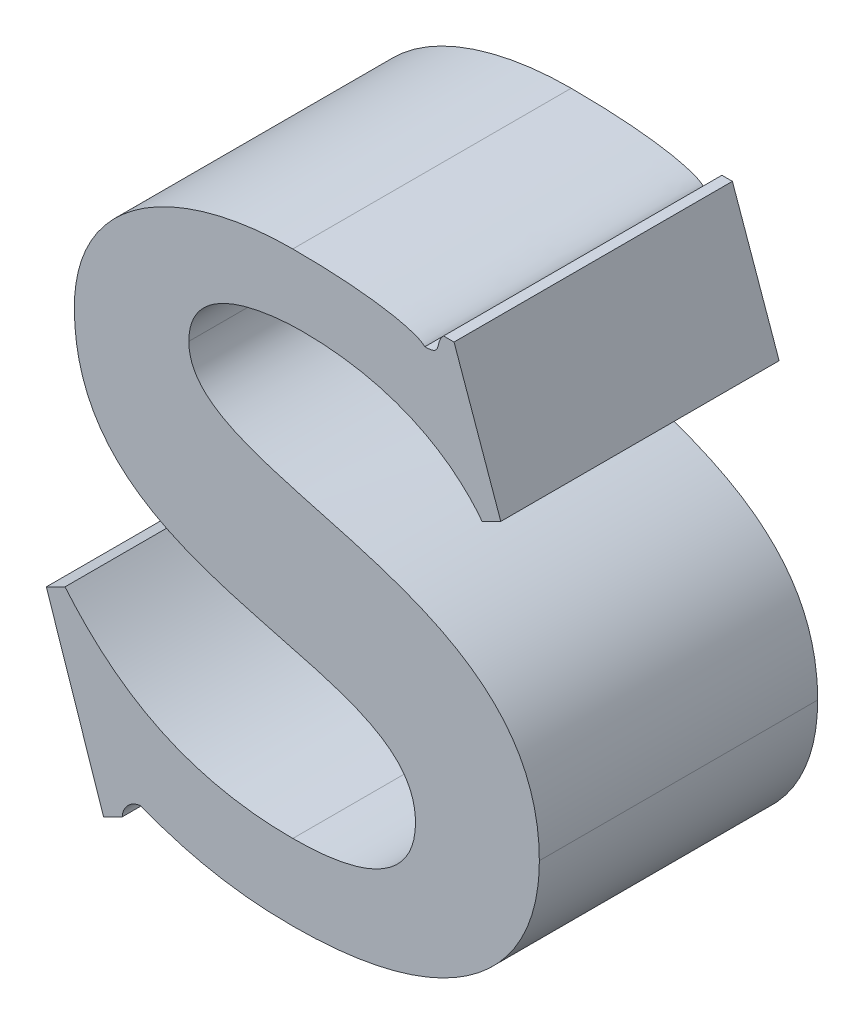
ISO-10303-21;
HEADER;
FILE_DESCRIPTION(('STEP AP214'),'2;1');
FILE_NAME('part.step','',(''),(''),'','','');
FILE_SCHEMA(('AUTOMOTIVE_DESIGN { 1 0 10303 214 1 1 1 1 }'));
ENDSEC;
DATA;
#1=APPLICATION_CONTEXT('core data for automotive mechanical design processes');
#2=APPLICATION_PROTOCOL_DEFINITION('international standard','automotive_design',2000,#1);
#3=PRODUCT_CONTEXT('',#1,'mechanical');
#4=PRODUCT('Part','Part','',(#3));
#5=PRODUCT_RELATED_PRODUCT_CATEGORY('part','',(#4));
#6=PRODUCT_DEFINITION_FORMATION('','',#4);
#7=PRODUCT_DEFINITION_CONTEXT('part definition',#1,'design');
#8=PRODUCT_DEFINITION('design','',#6,#7);
#9=PRODUCT_DEFINITION_SHAPE('','',#8);
#10=(LENGTH_UNIT() NAMED_UNIT(*) SI_UNIT(.MILLI.,.METRE.));
#11=(NAMED_UNIT(*) PLANE_ANGLE_UNIT() SI_UNIT($,.RADIAN.));
#12=(NAMED_UNIT(*) SI_UNIT($,.STERADIAN.) SOLID_ANGLE_UNIT());
#13=UNCERTAINTY_MEASURE_WITH_UNIT(LENGTH_MEASURE(1.E-05),#10,'distance_accuracy_value','');
#14=(GEOMETRIC_REPRESENTATION_CONTEXT(3) GLOBAL_UNCERTAINTY_ASSIGNED_CONTEXT((#13)) GLOBAL_UNIT_ASSIGNED_CONTEXT((#10,
#11,#12)) REPRESENTATION_CONTEXT('',''));
#15=CARTESIAN_POINT('',(0.,0.,0.));
#16=DIRECTION('',(0.,0.,1.));
#17=DIRECTION('',(1.,0.,0.));
#18=AXIS2_PLACEMENT_3D('',#15,#16,#17);
#19=CARTESIAN_POINT('',(1.577188536794,-0.08503020108,0.));
#20=DIRECTION('',(-0.447147128615345,0.894460421355273,0.));
#21=DIRECTION('',(-0.894460421355273,-0.447147128615345,0.));
#22=AXIS2_PLACEMENT_3D('',#19,#20,#21);
#23=PLANE('',#22);
#24=DIRECTION('',(0.894460421355273,0.447147128615345,0.));
#25=VECTOR('',#24,1.);
#26=CARTESIAN_POINT('',(1.57047170196,-0.088387994603,0.));
#27=LINE('',#26,#25);
#28=CARTESIAN_POINT('',(1.57047170196,-0.088387994603,0.));
#29=VERTEX_POINT('',#28);
#30=CARTESIAN_POINT('',(1.577188536794,-0.08503020108,0.));
#31=VERTEX_POINT('',#30);
#32=EDGE_CURVE('E11',#29,#31,#27,.T.);
#33=ORIENTED_EDGE('',*,*,#32,.F.);
#34=DIRECTION('',(0.,0.,1.));
#35=VECTOR('',#34,1.);
#36=CARTESIAN_POINT('',(1.57047170196,-0.088387994603,0.));
#37=LINE('',#36,#35);
#38=CARTESIAN_POINT('',(1.57047170196,-0.088387994603,0.1));
#39=VERTEX_POINT('',#38);
#40=EDGE_CURVE('E24',#29,#39,#37,.T.);
#41=ORIENTED_EDGE('',*,*,#40,.T.);
#42=DIRECTION('',(-0.894460421355273,-0.447147128615345,0.));
#43=VECTOR('',#42,1.);
#44=CARTESIAN_POINT('',(1.57047170196,-0.088387994603,0.1));
#45=LINE('',#44,#43);
#46=CARTESIAN_POINT('',(1.577188536794,-0.08503020108,0.1));
#47=VERTEX_POINT('',#46);
#48=EDGE_CURVE('E160',#47,#39,#45,.T.);
#49=ORIENTED_EDGE('',*,*,#48,.F.);
#50=DIRECTION('',(0.,0.,1.));
#51=VECTOR('',#50,1.);
#52=CARTESIAN_POINT('',(1.577188536794,-0.08503020108,0.));
#53=LINE('',#52,#51);
#54=EDGE_CURVE('E398',#31,#47,#53,.T.);
#55=ORIENTED_EDGE('',*,*,#54,.F.);
#56=EDGE_LOOP('',(#33,#41,#49,#55));
#57=FACE_BOUND('',#56,.T.);
#58=ADVANCED_FACE('F17',(#57),#23,.T.);
#59=CARTESIAN_POINT('',(1.659033038229,-0.12238503013781,0.));
#60=CARTESIAN_POINT('',(1.659033038229,-0.12238503013781,0.1));
#61=CARTESIAN_POINT('',(1.61831963578,-0.12238503013781,0.));
#62=CARTESIAN_POINT('',(1.61831963578,-0.12238503013781,0.1));
#63=CARTESIAN_POINT('',(1.594396448737,-0.10559637446581,0.));
#64=CARTESIAN_POINT('',(1.594396448737,-0.10559637446581,0.1));
#65=CARTESIAN_POINT('',(1.577188536794,-0.08503020108,0.));
#66=CARTESIAN_POINT('',(1.577188536794,-0.08503020108,0.1));
#67=B_SPLINE_SURFACE_WITH_KNOTS('',3,1,((#59,#60),(#61,#62),(#63,#64),(#65,#66)),.UNSPECIFIED.,
.F.,.F.,.F.,(4,4),(2,2),(-1.,0.),(0.,0.01),.UNSPECIFIED.);
#68=CARTESIAN_POINT('',(1.577188536794,-0.08503020108,0.));
#69=CARTESIAN_POINT('',(1.594396448737,-0.10559637446581,0.));
#70=CARTESIAN_POINT('',(1.61831963578,-0.12238503013781,0.));
#71=CARTESIAN_POINT('',(1.659033038229,-0.12238503013781,0.));
#72=B_SPLINE_CURVE_WITH_KNOTS('',3,(#68,#69,#70,#71),.UNSPECIFIED.,.F.,.F.,(4,4),(0.,1.),.UNSPECIFIED.);
#73=CARTESIAN_POINT('',(1.659033038229,-0.12238503013781,0.));
#74=VERTEX_POINT('',#73);
#75=EDGE_CURVE('E391',#31,#74,#72,.T.);
#76=CARTESIAN_POINT('',(1.659033038229,-0.12238503013781,0.1));
#77=CARTESIAN_POINT('',(1.61831963578,-0.12238503013781,0.1));
#78=CARTESIAN_POINT('',(1.594396448737,-0.10559637446581,0.1));
#79=CARTESIAN_POINT('',(1.577188536794,-0.08503020108,0.1));
#80=B_SPLINE_CURVE_WITH_KNOTS('',3,(#76,#77,#78,#79),.UNSPECIFIED.,.F.,.F.,(4,4),(-1.,0.),.UNSPECIFIED.);
#81=CARTESIAN_POINT('',(1.659033038229,-0.12238503013781,0.1));
#82=VERTEX_POINT('',#81);
#83=EDGE_CURVE('E387',#82,#47,#80,.T.);
#84=DIRECTION('',(0.,0.,1.));
#85=VECTOR('',#84,1.);
#86=CARTESIAN_POINT('',(1.659033038229,-0.12238503013781,0.));
#87=LINE('',#86,#85);
#88=EDGE_CURVE('E381',#74,#82,#87,.T.);
#89=ORIENTED_EDGE('',*,*,#75,.F.);
#90=ORIENTED_EDGE('',*,*,#54,.T.);
#91=ORIENTED_EDGE('',*,*,#83,.F.);
#92=ORIENTED_EDGE('',*,*,#88,.F.);
#93=EDGE_LOOP('',(#89,#90,#91,#92));
#94=FACE_BOUND('',#93,.T.);
#95=ADVANCED_FACE('F463',(#94),#67,.T.);
#96=CARTESIAN_POINT('',(1.703102362521,-0.095523087479,0.));
#97=CARTESIAN_POINT('',(1.703102362521,-0.095523087479,0.1));
#98=CARTESIAN_POINT('',(1.703102362521,-0.10895404321088,0.));
#99=CARTESIAN_POINT('',(1.703102362521,-0.10895404321088,0.1));
#100=CARTESIAN_POINT('',(1.69302991779,-0.12238503013781,0.));
#101=CARTESIAN_POINT('',(1.69302991779,-0.12238503013781,0.1));
#102=CARTESIAN_POINT('',(1.659033038229,-0.12238503013781,0.));
#103=CARTESIAN_POINT('',(1.659033038229,-0.12238503013781,0.1));
#104=B_SPLINE_SURFACE_WITH_KNOTS('',3,1,((#96,#97),(#98,#99),(#100,#101),(#102,#103)),
.UNSPECIFIED.,.F.,.F.,.F.,(4,4),(2,2),(-1.,0.),(0.,0.01),.UNSPECIFIED.);
#105=CARTESIAN_POINT('',(1.659033038229,-0.12238503013781,0.));
#106=CARTESIAN_POINT('',(1.69302991779,-0.12238503013781,0.));
#107=CARTESIAN_POINT('',(1.703102362521,-0.10895404321088,0.));
#108=CARTESIAN_POINT('',(1.703102362521,-0.095523087479,0.));
#109=B_SPLINE_CURVE_WITH_KNOTS('',3,(#105,#106,#107,#108),.UNSPECIFIED.,.F.,.F.,(4,4),(0.,1.),.UNSPECIFIED.);
#110=CARTESIAN_POINT('',(1.703102362521,-0.095523087479,0.));
#111=VERTEX_POINT('',#110);
#112=EDGE_CURVE('E374',#74,#111,#109,.T.);
#113=CARTESIAN_POINT('',(1.703102362521,-0.095523087479,0.1));
#114=CARTESIAN_POINT('',(1.703102362521,-0.10895404321088,0.1));
#115=CARTESIAN_POINT('',(1.69302991779,-0.12238503013781,0.1));
#116=CARTESIAN_POINT('',(1.659033038229,-0.12238503013781,0.1));
#117=B_SPLINE_CURVE_WITH_KNOTS('',3,(#113,#114,#115,#116),.UNSPECIFIED.,.F.,.F.,(4,4),(-1.,0.),.UNSPECIFIED.);
#118=CARTESIAN_POINT('',(1.703102362521,-0.095523087479,0.1));
#119=VERTEX_POINT('',#118);
#120=EDGE_CURVE('E369',#119,#82,#117,.T.);
#121=DIRECTION('',(0.,0.,1.));
#122=VECTOR('',#121,1.);
#123=CARTESIAN_POINT('',(1.703102362521,-0.095523087479,0.));
#124=LINE('',#123,#122);
#125=EDGE_CURVE('E363',#111,#119,#124,.T.);
#126=ORIENTED_EDGE('',*,*,#112,.F.);
#127=ORIENTED_EDGE('',*,*,#88,.T.);
#128=ORIENTED_EDGE('',*,*,#120,.F.);
#129=ORIENTED_EDGE('',*,*,#125,.F.);
#130=EDGE_LOOP('',(#126,#127,#128,#129));
#131=FACE_BOUND('',#130,.T.);
#132=ADVANCED_FACE('F459',(#131),#104,.T.);
#133=CARTESIAN_POINT('',(1.580545394478,0.00352991859700003,0.));
#134=CARTESIAN_POINT('',(1.580545394478,0.00352991859700003,0.1));
#135=CARTESIAN_POINT('',(1.580545394478,-0.078314832395,0.));
#136=CARTESIAN_POINT('',(1.580545394478,-0.078314832395,0.1));
#137=CARTESIAN_POINT('',(1.703102362521,-0.047675465605,0.));
#138=CARTESIAN_POINT('',(1.703102362521,-0.047675465605,0.1));
#139=CARTESIAN_POINT('',(1.703102362521,-0.095523087479,0.));
#140=CARTESIAN_POINT('',(1.703102362521,-0.095523087479,0.1));
#141=B_SPLINE_SURFACE_WITH_KNOTS('',3,1,((#133,#134),(#135,#136),(#137,#138),(#139,#140)),
.UNSPECIFIED.,.F.,.F.,.F.,(4,4),(2,2),(-1.,0.),(0.,0.01),.UNSPECIFIED.);
#142=CARTESIAN_POINT('',(1.703102362521,-0.095523087479,0.));
#143=CARTESIAN_POINT('',(1.703102362521,-0.047675465605,0.));
#144=CARTESIAN_POINT('',(1.580545394478,-0.078314832395,0.));
#145=CARTESIAN_POINT('',(1.580545394478,0.00352991859700003,0.));
#146=B_SPLINE_CURVE_WITH_KNOTS('',3,(#142,#143,#144,#145),.UNSPECIFIED.,.F.,.F.,(4,4),(0.,1.),.UNSPECIFIED.);
#147=CARTESIAN_POINT('',(1.580545394478,0.00352991859700003,0.));
#148=VERTEX_POINT('',#147);
#149=EDGE_CURVE('E356',#111,#148,#146,.T.);
#150=CARTESIAN_POINT('',(1.580545394478,0.00352991859700003,0.1));
#151=CARTESIAN_POINT('',(1.580545394478,-0.078314832395,0.1));
#152=CARTESIAN_POINT('',(1.703102362521,-0.047675465605,0.1));
#153=CARTESIAN_POINT('',(1.703102362521,-0.095523087479,0.1));
#154=B_SPLINE_CURVE_WITH_KNOTS('',3,(#150,#151,#152,#153),.UNSPECIFIED.,.F.,.F.,(4,4),(-1.,0.),.UNSPECIFIED.);
#155=CARTESIAN_POINT('',(1.580545394478,0.00352991859700003,0.1));
#156=VERTEX_POINT('',#155);
#157=EDGE_CURVE('E351',#156,#119,#154,.T.);
#158=DIRECTION('',(0.,0.,1.));
#159=VECTOR('',#158,1.);
#160=CARTESIAN_POINT('',(1.580545394478,0.00352991859700003,0.));
#161=LINE('',#160,#159);
#162=EDGE_CURVE('E345',#148,#156,#161,.T.);
#163=ORIENTED_EDGE('',*,*,#149,.F.);
#164=ORIENTED_EDGE('',*,*,#125,.T.);
#165=ORIENTED_EDGE('',*,*,#157,.F.);
#166=ORIENTED_EDGE('',*,*,#162,.F.);
#167=EDGE_LOOP('',(#163,#164,#165,#166));
#168=FACE_BOUND('',#167,.T.);
#169=ADVANCED_FACE('F455',(#168),#141,.T.);
#170=CARTESIAN_POINT('',(1.659033038229,0.061031103267,0.));
#171=CARTESIAN_POINT('',(1.659033038229,0.061031103267,0.1));
#172=CARTESIAN_POINT('',(1.61831963578,0.0610311032670001,0.));
#173=CARTESIAN_POINT('',(1.61831963578,0.0610311032670001,0.1));
#174=CARTESIAN_POINT('',(1.580545394478,0.0408846540710001,0.));
#175=CARTESIAN_POINT('',(1.580545394478,0.0408846540710001,0.1));
#176=CARTESIAN_POINT('',(1.580545394478,0.00352991859700003,0.));
#177=CARTESIAN_POINT('',(1.580545394478,0.00352991859700003,0.1));
#178=B_SPLINE_SURFACE_WITH_KNOTS('',3,1,((#170,#171),(#172,#173),(#174,#175),(#176,#177)),
.UNSPECIFIED.,.F.,.F.,.F.,(4,4),(2,2),(-1.,0.),(0.,0.01),.UNSPECIFIED.);
#179=CARTESIAN_POINT('',(1.580545394478,0.00352991859700003,0.));
#180=CARTESIAN_POINT('',(1.580545394478,0.0408846540710001,0.));
#181=CARTESIAN_POINT('',(1.61831963578,0.0610311032670001,0.));
#182=CARTESIAN_POINT('',(1.659033038229,0.061031103267,0.));
#183=B_SPLINE_CURVE_WITH_KNOTS('',3,(#179,#180,#181,#182),.UNSPECIFIED.,.F.,.F.,(4,4),(0.,1.),.UNSPECIFIED.);
#184=CARTESIAN_POINT('',(1.659033038229,0.061031103267,0.));
#185=VERTEX_POINT('',#184);
#186=EDGE_CURVE('E338',#148,#185,#183,.T.);
#187=CARTESIAN_POINT('',(1.659033038229,0.061031103267,0.1));
#188=CARTESIAN_POINT('',(1.61831963578,0.0610311032670001,0.1));
#189=CARTESIAN_POINT('',(1.580545394478,0.0408846540710001,0.1));
#190=CARTESIAN_POINT('',(1.580545394478,0.00352991859700003,0.1));
#191=B_SPLINE_CURVE_WITH_KNOTS('',3,(#187,#188,#189,#190),.UNSPECIFIED.,.F.,.F.,(4,4),(-1.,0.),.UNSPECIFIED.);
#192=CARTESIAN_POINT('',(1.659033038229,0.061031103267,0.1));
#193=VERTEX_POINT('',#192);
#194=EDGE_CURVE('E333',#193,#156,#191,.T.);
#195=DIRECTION('',(0.,0.,1.));
#196=VECTOR('',#195,1.);
#197=CARTESIAN_POINT('',(1.659033038229,0.061031103267,0.));
#198=LINE('',#197,#196);
#199=EDGE_CURVE('E327',#185,#193,#198,.T.);
#200=ORIENTED_EDGE('',*,*,#186,.F.);
#201=ORIENTED_EDGE('',*,*,#162,.T.);
#202=ORIENTED_EDGE('',*,*,#194,.F.);
#203=ORIENTED_EDGE('',*,*,#199,.F.);
#204=EDGE_LOOP('',(#200,#201,#202,#203));
#205=FACE_BOUND('',#204,.T.);
#206=ADVANCED_FACE('F451',(#205),#178,.T.);
#207=CARTESIAN_POINT('',(1.706460779938,0.054315609803,0.));
#208=CARTESIAN_POINT('',(1.706460779938,0.054315609803,0.1));
#209=CARTESIAN_POINT('',(1.703102362521,0.0576734345219999,0.));
#210=CARTESIAN_POINT('',(1.703102362521,0.0576734345219999,0.1));
#211=CARTESIAN_POINT('',(1.686314642689,0.061031103267,0.));
#212=CARTESIAN_POINT('',(1.686314642689,0.061031103267,0.1));
#213=CARTESIAN_POINT('',(1.659033038229,0.061031103267,0.));
#214=CARTESIAN_POINT('',(1.659033038229,0.061031103267,0.1));
#215=B_SPLINE_SURFACE_WITH_KNOTS('',3,1,((#207,#208),(#209,#210),(#211,#212),(#213,#214)),
.UNSPECIFIED.,.F.,.F.,.F.,(4,4),(2,2),(-1.,0.),(0.,0.01),.UNSPECIFIED.);
#216=CARTESIAN_POINT('',(1.659033038229,0.061031103267,0.));
#217=CARTESIAN_POINT('',(1.686314642689,0.061031103267,0.));
#218=CARTESIAN_POINT('',(1.703102362521,0.0576734345219999,0.));
#219=CARTESIAN_POINT('',(1.706460779938,0.054315609803,0.));
#220=B_SPLINE_CURVE_WITH_KNOTS('',3,(#216,#217,#218,#219),.UNSPECIFIED.,.F.,.F.,(4,4),(0.,1.),.UNSPECIFIED.);
#221=CARTESIAN_POINT('',(1.706460779938,0.054315609803,0.));
#222=VERTEX_POINT('',#221);
#223=EDGE_CURVE('E320',#185,#222,#220,.T.);
#224=CARTESIAN_POINT('',(1.706460779938,0.054315609803,0.1));
#225=CARTESIAN_POINT('',(1.703102362521,0.0576734345219999,0.1));
#226=CARTESIAN_POINT('',(1.686314642689,0.061031103267,0.1));
#227=CARTESIAN_POINT('',(1.659033038229,0.061031103267,0.1));
#228=B_SPLINE_CURVE_WITH_KNOTS('',3,(#224,#225,#226,#227),.UNSPECIFIED.,.F.,.F.,(4,4),(-1.,0.),.UNSPECIFIED.);
#229=CARTESIAN_POINT('',(1.706460779938,0.054315609803,0.1));
#230=VERTEX_POINT('',#229);
#231=EDGE_CURVE('E315',#230,#193,#228,.T.);
#232=DIRECTION('',(0.,0.,1.));
#233=VECTOR('',#232,1.);
#234=CARTESIAN_POINT('',(1.706460779938,0.054315609803,0.));
#235=LINE('',#234,#233);
#236=EDGE_CURVE('E309',#222,#230,#235,.T.);
#237=ORIENTED_EDGE('',*,*,#223,.F.);
#238=ORIENTED_EDGE('',*,*,#199,.T.);
#239=ORIENTED_EDGE('',*,*,#231,.F.);
#240=ORIENTED_EDGE('',*,*,#236,.F.);
#241=EDGE_LOOP('',(#237,#238,#239,#240));
#242=FACE_BOUND('',#241,.T.);
#243=ADVANCED_FACE('F447',(#242),#215,.T.);
#244=CARTESIAN_POINT('',(1.713176055039,0.061031103267,0.));
#245=CARTESIAN_POINT('',(1.713176055039,0.061031103267,0.1));
#246=CARTESIAN_POINT('',(1.709817637622,0.0576734345219997,0.));
#247=CARTESIAN_POINT('',(1.709817637622,0.0576734345219997,0.1));
#248=CARTESIAN_POINT('',(1.713176055039,0.0543156098029996,0.));
#249=CARTESIAN_POINT('',(1.713176055039,0.0543156098029996,0.1));
#250=CARTESIAN_POINT('',(1.706460779938,0.054315609803,0.));
#251=CARTESIAN_POINT('',(1.706460779938,0.054315609803,0.1));
#252=B_SPLINE_SURFACE_WITH_KNOTS('',3,1,((#244,#245),(#246,#247),(#248,#249),(#250,#251)),
.UNSPECIFIED.,.F.,.F.,.F.,(4,4),(2,2),(-1.,0.),(0.,0.01),.UNSPECIFIED.);
#253=CARTESIAN_POINT('',(1.706460779938,0.054315609803,0.));
#254=CARTESIAN_POINT('',(1.713176055039,0.0543156098029996,0.));
#255=CARTESIAN_POINT('',(1.709817637622,0.0576734345219997,0.));
#256=CARTESIAN_POINT('',(1.713176055039,0.061031103267,0.));
#257=B_SPLINE_CURVE_WITH_KNOTS('',3,(#253,#254,#255,#256),.UNSPECIFIED.,.F.,.F.,(4,4),(0.,1.),.UNSPECIFIED.);
#258=CARTESIAN_POINT('',(1.713176055039,0.061031103267,0.));
#259=VERTEX_POINT('',#258);
#260=EDGE_CURVE('E302',#222,#259,#257,.T.);
#261=CARTESIAN_POINT('',(1.713176055039,0.061031103267,0.1));
#262=CARTESIAN_POINT('',(1.709817637622,0.0576734345219997,0.1));
#263=CARTESIAN_POINT('',(1.713176055039,0.0543156098029996,0.1));
#264=CARTESIAN_POINT('',(1.706460779938,0.054315609803,0.1));
#265=B_SPLINE_CURVE_WITH_KNOTS('',3,(#261,#262,#263,#264),.UNSPECIFIED.,.F.,.F.,(4,4),(-1.,0.),.UNSPECIFIED.);
#266=CARTESIAN_POINT('',(1.713176055039,0.061031103267,0.1));
#267=VERTEX_POINT('',#266);
#268=EDGE_CURVE('E297',#267,#230,#265,.T.);
#269=DIRECTION('',(0.,0.,1.));
#270=VECTOR('',#269,1.);
#271=CARTESIAN_POINT('',(1.713176055039,0.061031103267,0.));
#272=LINE('',#271,#270);
#273=EDGE_CURVE('E294',#259,#267,#272,.T.);
#274=ORIENTED_EDGE('',*,*,#260,.F.);
#275=ORIENTED_EDGE('',*,*,#236,.T.);
#276=ORIENTED_EDGE('',*,*,#268,.F.);
#277=ORIENTED_EDGE('',*,*,#273,.F.);
#278=EDGE_LOOP('',(#274,#275,#276,#277));
#279=FACE_BOUND('',#278,.T.);
#280=ADVANCED_FACE('F443',(#279),#252,.T.);
#281=CARTESIAN_POINT('',(1.716953104833,0.061031103267,0.));
#282=DIRECTION('',(0.,1.,0.));
#283=DIRECTION('',(-1.,0.,0.));
#284=AXIS2_PLACEMENT_3D('',#281,#282,#283);
#285=PLANE('',#284);
#286=DIRECTION('',(1.,0.,0.));
#287=VECTOR('',#286,1.);
#288=CARTESIAN_POINT('',(1.713176055039,0.061031103267,0.));
#289=LINE('',#288,#287);
#290=CARTESIAN_POINT('',(1.716953104833,0.061031103267,0.));
#291=VERTEX_POINT('',#290);
#292=EDGE_CURVE('E292',#259,#291,#289,.T.);
#293=ORIENTED_EDGE('',*,*,#292,.F.);
#294=ORIENTED_EDGE('',*,*,#273,.T.);
#295=DIRECTION('',(-1.,0.,0.));
#296=VECTOR('',#295,1.);
#297=CARTESIAN_POINT('',(1.713176055039,0.061031103267,0.1));
#298=LINE('',#297,#296);
#299=CARTESIAN_POINT('',(1.716953104833,0.061031103267,0.1));
#300=VERTEX_POINT('',#299);
#301=EDGE_CURVE('E289',#300,#267,#298,.T.);
#302=ORIENTED_EDGE('',*,*,#301,.F.);
#303=DIRECTION('',(0.,0.,1.));
#304=VECTOR('',#303,1.);
#305=CARTESIAN_POINT('',(1.716953104833,0.061031103267,0.));
#306=LINE('',#305,#304);
#307=EDGE_CURVE('E286',#291,#300,#306,.T.);
#308=ORIENTED_EDGE('',*,*,#307,.F.);
#309=EDGE_LOOP('',(#293,#294,#302,#308));
#310=FACE_BOUND('',#309,.T.);
#311=ADVANCED_FACE('F439',(#310),#285,.T.);
#312=CARTESIAN_POINT('',(1.733742384398,0.013603112,0.));
#313=DIRECTION('',(0.942678091152355,0.33370348583938,0.));
#314=DIRECTION('',(-0.33370348583938,0.942678091152355,0.));
#315=AXIS2_PLACEMENT_3D('',#312,#313,#314);
#316=PLANE('',#315);
#317=DIRECTION('',(0.33370348583938,-0.942678091152355,0.));
#318=VECTOR('',#317,1.);
#319=CARTESIAN_POINT('',(1.716953104833,0.061031103267,0.));
#320=LINE('',#319,#318);
#321=CARTESIAN_POINT('',(1.733742384398,0.013603112,0.));
#322=VERTEX_POINT('',#321);
#323=EDGE_CURVE('E284',#291,#322,#320,.T.);
#324=ORIENTED_EDGE('',*,*,#323,.F.);
#325=ORIENTED_EDGE('',*,*,#307,.T.);
#326=DIRECTION('',(-0.33370348583938,0.942678091152355,0.));
#327=VECTOR('',#326,1.);
#328=CARTESIAN_POINT('',(1.716953104833,0.061031103267,0.1));
#329=LINE('',#328,#327);
#330=CARTESIAN_POINT('',(1.733742384398,0.013603112,0.1));
#331=VERTEX_POINT('',#330);
#332=EDGE_CURVE('E281',#331,#300,#329,.T.);
#333=ORIENTED_EDGE('',*,*,#332,.F.);
#334=DIRECTION('',(0.,0.,1.));
#335=VECTOR('',#334,1.);
#336=CARTESIAN_POINT('',(1.733742384398,0.013603112,0.));
#337=LINE('',#336,#335);
#338=EDGE_CURVE('E278',#322,#331,#337,.T.);
#339=ORIENTED_EDGE('',*,*,#338,.F.);
#340=EDGE_LOOP('',(#324,#325,#333,#339));
#341=FACE_BOUND('',#340,.T.);
#342=ADVANCED_FACE('F435',(#341),#316,.T.);
#343=CARTESIAN_POINT('',(1.727026797351,0.01024541206,0.));
#344=DIRECTION('',(0.447203624151053,-0.894432176604891,0.));
#345=DIRECTION('',(0.894432176604891,0.447203624151053,0.));
#346=AXIS2_PLACEMENT_3D('',#343,#344,#345);
#347=PLANE('',#346);
#348=DIRECTION('',(-0.894432176604891,-0.447203624151053,0.));
#349=VECTOR('',#348,1.);
#350=CARTESIAN_POINT('',(1.733742384398,0.013603112,0.));
#351=LINE('',#350,#349);
#352=CARTESIAN_POINT('',(1.727026797351,0.01024541206,0.));
#353=VERTEX_POINT('',#352);
#354=EDGE_CURVE('E276',#322,#353,#351,.T.);
#355=ORIENTED_EDGE('',*,*,#354,.F.);
#356=ORIENTED_EDGE('',*,*,#338,.T.);
#357=DIRECTION('',(0.894432176604891,0.447203624151053,0.));
#358=VECTOR('',#357,1.);
#359=CARTESIAN_POINT('',(1.733742384398,0.013603112,0.1));
#360=LINE('',#359,#358);
#361=CARTESIAN_POINT('',(1.727026797351,0.01024541206,0.1));
#362=VERTEX_POINT('',#361);
#363=EDGE_CURVE('E273',#362,#331,#360,.T.);
#364=ORIENTED_EDGE('',*,*,#363,.F.);
#365=DIRECTION('',(0.,0.,1.));
#366=VECTOR('',#365,1.);
#367=CARTESIAN_POINT('',(1.727026797351,0.01024541206,0.));
#368=LINE('',#367,#366);
#369=EDGE_CURVE('E267',#353,#362,#368,.T.);
#370=ORIENTED_EDGE('',*,*,#369,.F.);
#371=EDGE_LOOP('',(#355,#356,#364,#370));
#372=FACE_BOUND('',#371,.T.);
#373=ADVANCED_FACE('F431',(#372),#347,.T.);
#374=CARTESIAN_POINT('',(1.662390207859,0.037107229941,0.));
#375=CARTESIAN_POINT('',(1.662390207859,0.037107229941,0.1));
#376=CARTESIAN_POINT('',(1.677661290627,0.0371072299409998,0.));
#377=CARTESIAN_POINT('',(1.677661290627,0.0371072299409998,0.1));
#378=CARTESIAN_POINT('',(1.690242679099,0.0343974842097056,0.));
#379=CARTESIAN_POINT('',(1.690242679099,0.0343974842097056,0.1));
#380=CARTESIAN_POINT('',(1.70605954615,0.0278138539980836,0.));
#381=CARTESIAN_POINT('',(1.70605954615,0.0278138539980836,0.1));
#382=CARTESIAN_POINT('',(1.711428924585,0.0247907650219827,0.));
#383=CARTESIAN_POINT('',(1.711428924585,0.0247907650219827,0.1));
#384=CARTESIAN_POINT('',(1.720311878263,0.0179268910252067,0.));
#385=CARTESIAN_POINT('',(1.720311878263,0.0179268910252067,0.1));
#386=CARTESIAN_POINT('',(1.723980087419,0.0143075095671831,0.));
#387=CARTESIAN_POINT('',(1.723980087419,0.0143075095671831,0.1));
#388=CARTESIAN_POINT('',(1.727026797351,0.01024541206,0.));
#389=CARTESIAN_POINT('',(1.727026797351,0.01024541206,0.1));
#390=B_SPLINE_SURFACE_WITH_KNOTS('',3,1,((#374,#375),(#376,#377),(#378,#379),(#380,#381),(#382,
#383),(#384,#385),(#386,#387),(#388,#389)),.UNSPECIFIED.,.F.,.F.,.F.,(4,2,2,4),(2,2),
(-0.006623543838758,-0.003350800198409,-0.001523311189817,0.),(0.,0.01),.UNSPECIFIED.);
#391=CARTESIAN_POINT('',(1.727026797351,0.01024541206,0.));
#392=CARTESIAN_POINT('',(1.723980087419,0.0143075095671831,0.));
#393=CARTESIAN_POINT('',(1.720311878263,0.0179268910252067,0.));
#394=CARTESIAN_POINT('',(1.711428924585,0.0247907650219827,0.));
#395=CARTESIAN_POINT('',(1.70605954615,0.0278138539980836,0.));
#396=CARTESIAN_POINT('',(1.690242679099,0.0343974842097056,0.));
#397=CARTESIAN_POINT('',(1.677661290627,0.0371072299409998,0.));
#398=CARTESIAN_POINT('',(1.662390207859,0.037107229941,0.));
#399=B_SPLINE_CURVE_WITH_KNOTS('',3,(#391,#392,#393,#394,#395,#396,#397,#398),.UNSPECIFIED.,.F.,
.F.,(4,2,2,4),(0.,0.001523311189817,0.003350800198409,0.006623543838758),.UNSPECIFIED.);
#400=CARTESIAN_POINT('',(1.662390207859,0.037107229941,0.));
#401=VERTEX_POINT('',#400);
#402=EDGE_CURVE('E260',#353,#401,#399,.T.);
#403=CARTESIAN_POINT('',(1.662390207859,0.037107229941,0.1));
#404=CARTESIAN_POINT('',(1.677661290627,0.0371072299409998,0.1));
#405=CARTESIAN_POINT('',(1.690242679099,0.0343974842097056,0.1));
#406=CARTESIAN_POINT('',(1.70605954615,0.0278138539980836,0.1));
#407=CARTESIAN_POINT('',(1.711428924585,0.0247907650219827,0.1));
#408=CARTESIAN_POINT('',(1.720311878263,0.0179268910252067,0.1));
#409=CARTESIAN_POINT('',(1.723980087419,0.0143075095671831,0.1));
#410=CARTESIAN_POINT('',(1.727026797351,0.01024541206,0.1));
#411=B_SPLINE_CURVE_WITH_KNOTS('',3,(#403,#404,#405,#406,#407,#408,#409,#410),.UNSPECIFIED.,.F.,
.F.,(4,2,2,4),(-0.006623543838758,-0.003350800198409,-0.001523311189817,0.),.UNSPECIFIED.);
#412=CARTESIAN_POINT('',(1.662390207859,0.037107229941,0.1));
#413=VERTEX_POINT('',#412);
#414=EDGE_CURVE('E255',#413,#362,#411,.T.);
#415=DIRECTION('',(0.,0.,1.));
#416=VECTOR('',#415,1.);
#417=CARTESIAN_POINT('',(1.662390207859,0.037107229941,0.));
#418=LINE('',#417,#416);
#419=EDGE_CURVE('E249',#401,#413,#418,.T.);
#420=ORIENTED_EDGE('',*,*,#402,.F.);
#421=ORIENTED_EDGE('',*,*,#369,.T.);
#422=ORIENTED_EDGE('',*,*,#414,.F.);
#423=ORIENTED_EDGE('',*,*,#419,.F.);
#424=EDGE_LOOP('',(#420,#421,#422,#423));
#425=FACE_BOUND('',#424,.T.);
#426=ADVANCED_FACE('F427',(#425),#390,.T.);
#427=CARTESIAN_POINT('',(1.62167774125,0.013603112,0.));
#428=CARTESIAN_POINT('',(1.62167774125,0.013603112,0.1));
#429=CARTESIAN_POINT('',(1.62167774125,0.0337495611960002,0.));
#430=CARTESIAN_POINT('',(1.62167774125,0.0337495611960002,0.1));
#431=CARTESIAN_POINT('',(1.648959345711,0.0371072299410002,0.));
#432=CARTESIAN_POINT('',(1.648959345711,0.0371072299410002,0.1));
#433=CARTESIAN_POINT('',(1.662390207859,0.037107229941,0.));
#434=CARTESIAN_POINT('',(1.662390207859,0.037107229941,0.1));
#435=B_SPLINE_SURFACE_WITH_KNOTS('',3,1,((#427,#428),(#429,#430),(#431,#432),(#433,#434)),
.UNSPECIFIED.,.F.,.F.,.F.,(4,4),(2,2),(-1.,0.),(0.,0.01),.UNSPECIFIED.);
#436=CARTESIAN_POINT('',(1.662390207859,0.037107229941,0.));
#437=CARTESIAN_POINT('',(1.648959345711,0.0371072299410002,0.));
#438=CARTESIAN_POINT('',(1.62167774125,0.0337495611960002,0.));
#439=CARTESIAN_POINT('',(1.62167774125,0.013603112,0.));
#440=B_SPLINE_CURVE_WITH_KNOTS('',3,(#436,#437,#438,#439),.UNSPECIFIED.,.F.,.F.,(4,4),(0.,1.),.UNSPECIFIED.);
#441=CARTESIAN_POINT('',(1.62167774125,0.013603112,0.));
#442=VERTEX_POINT('',#441);
#443=EDGE_CURVE('E242',#401,#442,#440,.T.);
#444=CARTESIAN_POINT('',(1.62167774125,0.013603112,0.1));
#445=CARTESIAN_POINT('',(1.62167774125,0.0337495611960002,0.1));
#446=CARTESIAN_POINT('',(1.648959345711,0.0371072299410002,0.1));
#447=CARTESIAN_POINT('',(1.662390207859,0.037107229941,0.1));
#448=B_SPLINE_CURVE_WITH_KNOTS('',3,(#444,#445,#446,#447),.UNSPECIFIED.,.F.,.F.,(4,4),(-1.,0.),.UNSPECIFIED.);
#449=CARTESIAN_POINT('',(1.62167774125,0.013603112,0.1));
#450=VERTEX_POINT('',#449);
#451=EDGE_CURVE('E237',#450,#413,#448,.T.);
#452=DIRECTION('',(0.,0.,1.));
#453=VECTOR('',#452,1.);
#454=CARTESIAN_POINT('',(1.62167774125,0.013603112,0.));
#455=LINE('',#454,#453);
#456=EDGE_CURVE('E231',#442,#450,#455,.T.);
#457=ORIENTED_EDGE('',*,*,#443,.F.);
#458=ORIENTED_EDGE('',*,*,#419,.T.);
#459=ORIENTED_EDGE('',*,*,#451,.F.);
#460=ORIENTED_EDGE('',*,*,#456,.F.);
#461=EDGE_LOOP('',(#457,#458,#459,#460));
#462=FACE_BOUND('',#461,.T.);
#463=ADVANCED_FACE('F423',(#462),#435,.T.);
#464=CARTESIAN_POINT('',(1.74759312671,-0.08503020108,0.));
#465=CARTESIAN_POINT('',(1.74759312671,-0.08503020108,0.1));
#466=CARTESIAN_POINT('',(1.74759312671,-0.00360526786199997,0.));
#467=CARTESIAN_POINT('',(1.74759312671,-0.00360526786199997,0.1));
#468=CARTESIAN_POINT('',(1.62167774125,-0.027109416998,0.));
#469=CARTESIAN_POINT('',(1.62167774125,-0.027109416998,0.1));
#470=CARTESIAN_POINT('',(1.62167774125,0.013603112,0.));
#471=CARTESIAN_POINT('',(1.62167774125,0.013603112,0.1));
#472=B_SPLINE_SURFACE_WITH_KNOTS('',3,1,((#464,#465),(#466,#467),(#468,#469),(#470,#471)),
.UNSPECIFIED.,.F.,.F.,.F.,(4,4),(2,2),(-1.,0.),(0.,0.01),.UNSPECIFIED.);
#473=CARTESIAN_POINT('',(1.62167774125,0.013603112,0.));
#474=CARTESIAN_POINT('',(1.62167774125,-0.027109416998,0.));
#475=CARTESIAN_POINT('',(1.74759312671,-0.00360526786199997,0.));
#476=CARTESIAN_POINT('',(1.74759312671,-0.08503020108,0.));
#477=B_SPLINE_CURVE_WITH_KNOTS('',3,(#473,#474,#475,#476),.UNSPECIFIED.,.F.,.F.,(4,4),(0.,1.),.UNSPECIFIED.);
#478=CARTESIAN_POINT('',(1.74759312671,-0.08503020108,0.));
#479=VERTEX_POINT('',#478);
#480=EDGE_CURVE('E224',#442,#479,#477,.T.);
#481=CARTESIAN_POINT('',(1.74759312671,-0.08503020108,0.1));
#482=CARTESIAN_POINT('',(1.74759312671,-0.00360526786199997,0.1));
#483=CARTESIAN_POINT('',(1.62167774125,-0.027109416998,0.1));
#484=CARTESIAN_POINT('',(1.62167774125,0.013603112,0.1));
#485=B_SPLINE_CURVE_WITH_KNOTS('',3,(#481,#482,#483,#484),.UNSPECIFIED.,.F.,.F.,(4,4),(-1.,0.),.UNSPECIFIED.);
#486=CARTESIAN_POINT('',(1.74759312671,-0.08503020108,0.1));
#487=VERTEX_POINT('',#486);
#488=EDGE_CURVE('E219',#487,#450,#485,.T.);
#489=DIRECTION('',(0.,0.,1.));
#490=VECTOR('',#489,1.);
#491=CARTESIAN_POINT('',(1.74759312671,-0.08503020108,0.));
#492=LINE('',#491,#490);
#493=EDGE_CURVE('E213',#479,#487,#492,.T.);
#494=ORIENTED_EDGE('',*,*,#480,.F.);
#495=ORIENTED_EDGE('',*,*,#456,.T.);
#496=ORIENTED_EDGE('',*,*,#488,.F.);
#497=ORIENTED_EDGE('',*,*,#493,.F.);
#498=EDGE_LOOP('',(#494,#495,#496,#497));
#499=FACE_BOUND('',#498,.T.);
#500=ADVANCED_FACE('F419',(#499),#472,.T.);
#501=CARTESIAN_POINT('',(1.659033038229,-0.14966657220882,0.));
#502=CARTESIAN_POINT('',(1.659033038229,-0.14966657220882,0.1));
#503=CARTESIAN_POINT('',(1.716953104833,-0.14966657220882,0.));
#504=CARTESIAN_POINT('',(1.716953104833,-0.14966657220882,0.1));
#505=CARTESIAN_POINT('',(1.74759312671,-0.12238503013781,0.));
#506=CARTESIAN_POINT('',(1.74759312671,-0.12238503013781,0.1));
#507=CARTESIAN_POINT('',(1.74759312671,-0.08503020108,0.));
#508=CARTESIAN_POINT('',(1.74759312671,-0.08503020108,0.1));
#509=B_SPLINE_SURFACE_WITH_KNOTS('',3,1,((#501,#502),(#503,#504),(#505,#506),(#507,#508)),
.UNSPECIFIED.,.F.,.F.,.F.,(4,4),(2,2),(-1.,0.),(0.,0.01),.UNSPECIFIED.);
#510=CARTESIAN_POINT('',(1.74759312671,-0.08503020108,0.));
#511=CARTESIAN_POINT('',(1.74759312671,-0.12238503013781,0.));
#512=CARTESIAN_POINT('',(1.716953104833,-0.14966657220882,0.));
#513=CARTESIAN_POINT('',(1.659033038229,-0.14966657220882,0.));
#514=B_SPLINE_CURVE_WITH_KNOTS('',3,(#510,#511,#512,#513),.UNSPECIFIED.,.F.,.F.,(4,4),(0.,1.),.UNSPECIFIED.);
#515=CARTESIAN_POINT('',(1.659033038229,-0.14966657220882,0.));
#516=VERTEX_POINT('',#515);
#517=EDGE_CURVE('E206',#479,#516,#514,.T.);
#518=CARTESIAN_POINT('',(1.659033038229,-0.14966657220882,0.1));
#519=CARTESIAN_POINT('',(1.716953104833,-0.14966657220882,0.1));
#520=CARTESIAN_POINT('',(1.74759312671,-0.12238503013781,0.1));
#521=CARTESIAN_POINT('',(1.74759312671,-0.08503020108,0.1));
#522=B_SPLINE_CURVE_WITH_KNOTS('',3,(#518,#519,#520,#521),.UNSPECIFIED.,.F.,.F.,(4,4),(-1.,0.),.UNSPECIFIED.);
#523=CARTESIAN_POINT('',(1.659033038229,-0.14966657220882,0.1));
#524=VERTEX_POINT('',#523);
#525=EDGE_CURVE('E201',#524,#487,#522,.T.);
#526=DIRECTION('',(0.,0.,1.));
#527=VECTOR('',#526,1.);
#528=CARTESIAN_POINT('',(1.659033038229,-0.14966657220882,0.));
#529=LINE('',#528,#527);
#530=EDGE_CURVE('E195',#516,#524,#529,.T.);
#531=ORIENTED_EDGE('',*,*,#517,.F.);
#532=ORIENTED_EDGE('',*,*,#493,.T.);
#533=ORIENTED_EDGE('',*,*,#525,.F.);
#534=ORIENTED_EDGE('',*,*,#530,.F.);
#535=EDGE_LOOP('',(#531,#532,#533,#534));
#536=FACE_BOUND('',#535,.T.);
#537=ADVANCED_FACE('F415',(#536),#509,.T.);
#538=CARTESIAN_POINT('',(1.604469829308,-0.13959341000028,0.));
#539=CARTESIAN_POINT('',(1.604469829308,-0.13959341000028,0.1));
#540=CARTESIAN_POINT('',(1.62167774125,-0.14630890346375,0.));
#541=CARTESIAN_POINT('',(1.62167774125,-0.14630890346375,0.1));
#542=CARTESIAN_POINT('',(1.638467020816,-0.14966657220882,0.));
#543=CARTESIAN_POINT('',(1.638467020816,-0.14966657220882,0.1));
#544=CARTESIAN_POINT('',(1.659033038229,-0.14966657220882,0.));
#545=CARTESIAN_POINT('',(1.659033038229,-0.14966657220882,0.1));
#546=B_SPLINE_SURFACE_WITH_KNOTS('',3,1,((#538,#539),(#540,#541),(#542,#543),(#544,#545)),
.UNSPECIFIED.,.F.,.F.,.F.,(4,4),(2,2),(-1.,0.),(0.,0.01),.UNSPECIFIED.);
#547=CARTESIAN_POINT('',(1.659033038229,-0.14966657220882,0.));
#548=CARTESIAN_POINT('',(1.638467020816,-0.14966657220882,0.));
#549=CARTESIAN_POINT('',(1.62167774125,-0.14630890346375,0.));
#550=CARTESIAN_POINT('',(1.604469829308,-0.13959341000028,0.));
#551=B_SPLINE_CURVE_WITH_KNOTS('',3,(#547,#548,#549,#550),.UNSPECIFIED.,.F.,.F.,(4,4),(0.,1.),.UNSPECIFIED.);
#552=CARTESIAN_POINT('',(1.604469829308,-0.13959341000028,0.));
#553=VERTEX_POINT('',#552);
#554=EDGE_CURVE('E188',#516,#553,#551,.T.);
#555=CARTESIAN_POINT('',(1.604469829308,-0.13959341000028,0.1));
#556=CARTESIAN_POINT('',(1.62167774125,-0.14630890346375,0.1));
#557=CARTESIAN_POINT('',(1.638467020816,-0.14966657220882,0.1));
#558=CARTESIAN_POINT('',(1.659033038229,-0.14966657220882,0.1));
#559=B_SPLINE_CURVE_WITH_KNOTS('',3,(#555,#556,#557,#558),.UNSPECIFIED.,.F.,.F.,(4,4),(-1.,0.),.UNSPECIFIED.);
#560=CARTESIAN_POINT('',(1.604469829308,-0.13959341000028,0.1));
#561=VERTEX_POINT('',#560);
#562=EDGE_CURVE('E183',#561,#524,#559,.T.);
#563=DIRECTION('',(0.,0.,1.));
#564=VECTOR('',#563,1.);
#565=CARTESIAN_POINT('',(1.604469829308,-0.13959341000028,0.));
#566=LINE('',#565,#564);
#567=EDGE_CURVE('E177',#553,#561,#566,.T.);
#568=ORIENTED_EDGE('',*,*,#554,.F.);
#569=ORIENTED_EDGE('',*,*,#530,.T.);
#570=ORIENTED_EDGE('',*,*,#562,.F.);
#571=ORIENTED_EDGE('',*,*,#567,.F.);
#572=EDGE_LOOP('',(#568,#569,#570,#571));
#573=FACE_BOUND('',#572,.T.);
#574=ADVANCED_FACE('F411',(#573),#546,.T.);
#575=CARTESIAN_POINT('',(1.597754554207,-0.14630890346375,0.));
#576=CARTESIAN_POINT('',(1.597754554207,-0.14630890346375,0.1));
#577=CARTESIAN_POINT('',(1.597754554207,-0.14295107874535,0.));
#578=CARTESIAN_POINT('',(1.597754554207,-0.14295107874535,0.1));
#579=CARTESIAN_POINT('',(1.601111723837,-0.13959341000028,0.));
#580=CARTESIAN_POINT('',(1.601111723837,-0.13959341000028,0.1));
#581=CARTESIAN_POINT('',(1.604469829308,-0.13959341000028,0.));
#582=CARTESIAN_POINT('',(1.604469829308,-0.13959341000028,0.1));
#583=B_SPLINE_SURFACE_WITH_KNOTS('',3,1,((#575,#576),(#577,#578),(#579,#580),(#581,#582)),
.UNSPECIFIED.,.F.,.F.,.F.,(4,4),(2,2),(-1.,0.),(0.,0.01),.UNSPECIFIED.);
#584=CARTESIAN_POINT('',(1.604469829308,-0.13959341000028,0.));
#585=CARTESIAN_POINT('',(1.601111723837,-0.13959341000028,0.));
#586=CARTESIAN_POINT('',(1.597754554207,-0.14295107874535,0.));
#587=CARTESIAN_POINT('',(1.597754554207,-0.14630890346375,0.));
#588=B_SPLINE_CURVE_WITH_KNOTS('',3,(#584,#585,#586,#587),.UNSPECIFIED.,.F.,.F.,(4,4),(0.,1.),.UNSPECIFIED.);
#589=CARTESIAN_POINT('',(1.597754554207,-0.14630890346375,0.));
#590=VERTEX_POINT('',#589);
#591=EDGE_CURVE('E170',#553,#590,#588,.T.);
#592=CARTESIAN_POINT('',(1.597754554207,-0.14630890346375,0.1));
#593=CARTESIAN_POINT('',(1.597754554207,-0.14295107874535,0.1));
#594=CARTESIAN_POINT('',(1.601111723837,-0.13959341000028,0.1));
#595=CARTESIAN_POINT('',(1.604469829308,-0.13959341000028,0.1));
#596=B_SPLINE_CURVE_WITH_KNOTS('',3,(#592,#593,#594,#595),.UNSPECIFIED.,.F.,.F.,(4,4),(-1.,0.),.UNSPECIFIED.);
#597=CARTESIAN_POINT('',(1.597754554207,-0.14630890346375,0.1));
#598=VERTEX_POINT('',#597);
#599=EDGE_CURVE('E166',#598,#561,#596,.T.);
#600=DIRECTION('',(0.,0.,1.));
#601=VECTOR('',#600,1.);
#602=CARTESIAN_POINT('',(1.597754554207,-0.14630890346375,0.));
#603=LINE('',#602,#601);
#604=EDGE_CURVE('E145',#590,#598,#603,.T.);
#605=ORIENTED_EDGE('',*,*,#591,.F.);
#606=ORIENTED_EDGE('',*,*,#567,.T.);
#607=ORIENTED_EDGE('',*,*,#599,.F.);
#608=ORIENTED_EDGE('',*,*,#604,.F.);
#609=EDGE_LOOP('',(#605,#606,#607,#608));
#610=FACE_BOUND('',#609,.T.);
#611=ADVANCED_FACE('F409',(#610),#583,.T.);
#612=CARTESIAN_POINT('',(1.59103803132,-0.14966657220882,0.));
#613=DIRECTION('',(0.447150449295377,-0.894458761315994,0.));
#614=DIRECTION('',(0.894458761315994,0.447150449295377,0.));
#615=AXIS2_PLACEMENT_3D('',#612,#613,#614);
#616=PLANE('',#615);
#617=DIRECTION('',(-0.894458761315994,-0.447150449295377,0.));
#618=VECTOR('',#617,1.);
#619=CARTESIAN_POINT('',(1.597754554207,-0.14630890346375,0.));
#620=LINE('',#619,#618);
#621=CARTESIAN_POINT('',(1.59103803132,-0.14966657220882,0.));
#622=VERTEX_POINT('',#621);
#623=EDGE_CURVE('E149',#590,#622,#620,.T.);
#624=ORIENTED_EDGE('',*,*,#623,.F.);
#625=ORIENTED_EDGE('',*,*,#604,.T.);
#626=DIRECTION('',(0.894458761315994,0.447150449295377,0.));
#627=VECTOR('',#626,1.);
#628=CARTESIAN_POINT('',(1.597754554207,-0.14630890346375,0.1));
#629=LINE('',#628,#627);
#630=CARTESIAN_POINT('',(1.59103803132,-0.14966657220882,0.1));
#631=VERTEX_POINT('',#630);
#632=EDGE_CURVE('E138',#631,#598,#629,.T.);
#633=ORIENTED_EDGE('',*,*,#632,.F.);
#634=DIRECTION('',(0.,0.,1.));
#635=VECTOR('',#634,1.);
#636=CARTESIAN_POINT('',(1.59103803132,-0.14966657220882,0.));
#637=LINE('',#636,#635);
#638=EDGE_CURVE('E142',#622,#631,#637,.T.);
#639=ORIENTED_EDGE('',*,*,#638,.F.);
#640=EDGE_LOOP('',(#624,#625,#633,#639));
#641=FACE_BOUND('',#640,.T.);
#642=ADVANCED_FACE('F141',(#641),#616,.T.);
#643=CARTESIAN_POINT('',(1.57047170196,-0.088387994603,0.));
#644=DIRECTION('',(-0.948030881235892,-0.318178327708061,0.));
#645=DIRECTION('',(0.318178327708061,-0.948030881235892,0.));
#646=AXIS2_PLACEMENT_3D('',#643,#644,#645);
#647=PLANE('',#646);
#648=DIRECTION('',(-0.318178327708061,0.948030881235892,0.));
#649=VECTOR('',#648,1.);
#650=CARTESIAN_POINT('',(1.59103803132,-0.14966657220882,0.));
#651=LINE('',#650,#649);
#652=EDGE_CURVE('E155',#622,#29,#651,.T.);
#653=ORIENTED_EDGE('',*,*,#652,.F.);
#654=ORIENTED_EDGE('',*,*,#638,.T.);
#655=DIRECTION('',(0.318178327708061,-0.948030881235892,0.));
#656=VECTOR('',#655,1.);
#657=CARTESIAN_POINT('',(1.59103803132,-0.14966657220882,0.1));
#658=LINE('',#657,#656);
#659=EDGE_CURVE('E154',#39,#631,#658,.T.);
#660=ORIENTED_EDGE('',*,*,#659,.F.);
#661=ORIENTED_EDGE('',*,*,#40,.F.);
#662=EDGE_LOOP('',(#653,#654,#660,#661));
#663=FACE_BOUND('',#662,.T.);
#664=ADVANCED_FACE('F153',(#663),#647,.T.);
#665=CARTESIAN_POINT('',(1.658239073666,-0.0465421850586729,0.));
#666=DIRECTION('',(0.,0.,1.));
#667=DIRECTION('',(1.,0.,0.));
#668=AXIS2_PLACEMENT_3D('',#665,#666,#667);
#669=PLANE('',#668);
#670=ORIENTED_EDGE('',*,*,#652,.T.);
#671=ORIENTED_EDGE('',*,*,#32,.T.);
#672=ORIENTED_EDGE('',*,*,#75,.T.);
#673=ORIENTED_EDGE('',*,*,#112,.T.);
#674=ORIENTED_EDGE('',*,*,#149,.T.);
#675=ORIENTED_EDGE('',*,*,#186,.T.);
#676=ORIENTED_EDGE('',*,*,#223,.T.);
#677=ORIENTED_EDGE('',*,*,#260,.T.);
#678=ORIENTED_EDGE('',*,*,#292,.T.);
#679=ORIENTED_EDGE('',*,*,#323,.T.);
#680=ORIENTED_EDGE('',*,*,#354,.T.);
#681=ORIENTED_EDGE('',*,*,#402,.T.);
#682=ORIENTED_EDGE('',*,*,#443,.T.);
#683=ORIENTED_EDGE('',*,*,#480,.T.);
#684=ORIENTED_EDGE('',*,*,#517,.T.);
#685=ORIENTED_EDGE('',*,*,#554,.T.);
#686=ORIENTED_EDGE('',*,*,#591,.T.);
#687=ORIENTED_EDGE('',*,*,#623,.T.);
#688=EDGE_LOOP('',(#670,#671,#672,#673,#674,#675,#676,#677,#678,#679,#680,#681,#682,#683,#684,
#685,#686,#687));
#689=FACE_BOUND('',#688,.T.);
#690=ADVANCED_FACE('F404',(#689),#669,.F.);
#691=CARTESIAN_POINT('',(1.658239073666,-0.0465421850586729,0.1));
#692=DIRECTION('',(0.,0.,1.));
#693=DIRECTION('',(1.,0.,0.));
#694=AXIS2_PLACEMENT_3D('',#691,#692,#693);
#695=PLANE('',#694);
#696=ORIENTED_EDGE('',*,*,#659,.T.);
#697=ORIENTED_EDGE('',*,*,#632,.T.);
#698=ORIENTED_EDGE('',*,*,#599,.T.);
#699=ORIENTED_EDGE('',*,*,#562,.T.);
#700=ORIENTED_EDGE('',*,*,#525,.T.);
#701=ORIENTED_EDGE('',*,*,#488,.T.);
#702=ORIENTED_EDGE('',*,*,#451,.T.);
#703=ORIENTED_EDGE('',*,*,#414,.T.);
#704=ORIENTED_EDGE('',*,*,#363,.T.);
#705=ORIENTED_EDGE('',*,*,#332,.T.);
#706=ORIENTED_EDGE('',*,*,#301,.T.);
#707=ORIENTED_EDGE('',*,*,#268,.T.);
#708=ORIENTED_EDGE('',*,*,#231,.T.);
#709=ORIENTED_EDGE('',*,*,#194,.T.);
#710=ORIENTED_EDGE('',*,*,#157,.T.);
#711=ORIENTED_EDGE('',*,*,#120,.T.);
#712=ORIENTED_EDGE('',*,*,#83,.T.);
#713=ORIENTED_EDGE('',*,*,#48,.T.);
#714=EDGE_LOOP('',(#696,#697,#698,#699,#700,#701,#702,#703,#704,#705,#706,#707,#708,#709,#710,
#711,#712,#713));
#715=FACE_BOUND('',#714,.T.);
#716=ADVANCED_FACE('F158',(#715),#695,.T.);
#717=CLOSED_SHELL('',(#58,#95,#132,#169,#206,#243,#280,#311,#342,#373,#426,#463,#500,#537,#574,
#611,#642,#664,#690,#716));
#718=MANIFOLD_SOLID_BREP('B1',#717);
#719=ADVANCED_BREP_SHAPE_REPRESENTATION('',(#18,#718),#14);
#720=SHAPE_DEFINITION_REPRESENTATION(#9,#719);
ENDSEC;
END-ISO-10303-21;
